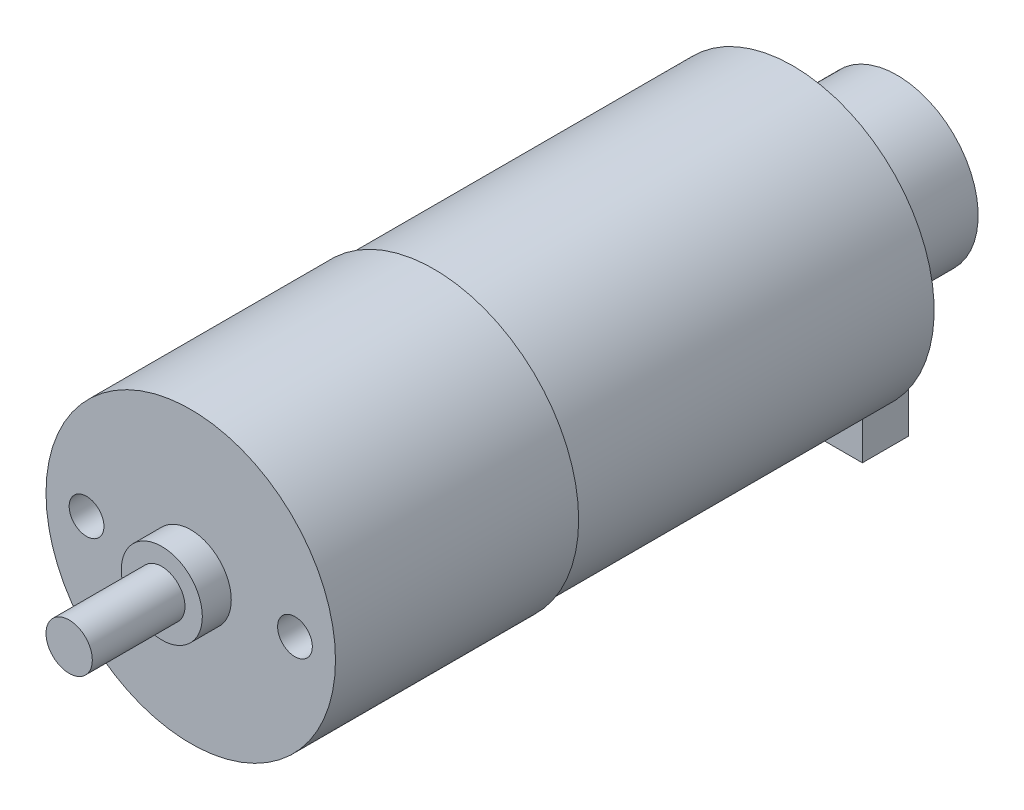
ISO-10303-21;
HEADER;
FILE_DESCRIPTION(('STEP AP214'),'2;1');
FILE_NAME('part.step','',(''),(''),'','','');
FILE_SCHEMA(('AUTOMOTIVE_DESIGN { 1 0 10303 214 1 1 1 1 }'));
ENDSEC;
DATA;
#1=APPLICATION_CONTEXT('core data for automotive mechanical design processes');
#2=APPLICATION_PROTOCOL_DEFINITION('international standard','automotive_design',2000,#1);
#3=PRODUCT_CONTEXT('',#1,'mechanical');
#4=PRODUCT('Part','Part','',(#3));
#5=PRODUCT_RELATED_PRODUCT_CATEGORY('part','',(#4));
#6=PRODUCT_DEFINITION_FORMATION('','',#4);
#7=PRODUCT_DEFINITION_CONTEXT('part definition',#1,'design');
#8=PRODUCT_DEFINITION('design','',#6,#7);
#9=PRODUCT_DEFINITION_SHAPE('','',#8);
#10=(LENGTH_UNIT() NAMED_UNIT(*) SI_UNIT(.MILLI.,.METRE.));
#11=(NAMED_UNIT(*) PLANE_ANGLE_UNIT() SI_UNIT($,.RADIAN.));
#12=(NAMED_UNIT(*) SI_UNIT($,.STERADIAN.) SOLID_ANGLE_UNIT());
#13=UNCERTAINTY_MEASURE_WITH_UNIT(LENGTH_MEASURE(1.E-05),#10,'distance_accuracy_value','');
#14=(GEOMETRIC_REPRESENTATION_CONTEXT(3) GLOBAL_UNCERTAINTY_ASSIGNED_CONTEXT((#13)) GLOBAL_UNIT_ASSIGNED_CONTEXT((#10,
#11,#12)) REPRESENTATION_CONTEXT('',''));
#15=CARTESIAN_POINT('',(0.,0.,0.));
#16=DIRECTION('',(0.,0.,1.));
#17=DIRECTION('',(1.,0.,0.));
#18=AXIS2_PLACEMENT_3D('',#15,#16,#17);
#19=CARTESIAN_POINT('',(0.,0.,0.));
#20=DIRECTION('',(0.,0.,1.));
#21=DIRECTION('',(1.,0.,0.));
#22=AXIS2_PLACEMENT_3D('',#19,#20,#21);
#23=PLANE('',#22);
#24=CARTESIAN_POINT('',(0.,0.,0.));
#25=DIRECTION('',(0.,0.,-1.));
#26=DIRECTION('',(-1.,0.,0.));
#27=AXIS2_PLACEMENT_3D('',#24,#25,#26);
#28=CIRCLE('',#27,7.);
#29=CARTESIAN_POINT('',(-7.,0.,0.));
#30=VERTEX_POINT('',#29);
#31=EDGE_CURVE('E51',#30,#30,#28,.T.);
#32=ORIENTED_EDGE('',*,*,#31,.F.);
#33=EDGE_LOOP('',(#32));
#34=FACE_BOUND('',#33,.T.);
#35=DIRECTION('',(0.,-1.,0.));
#36=VECTOR('',#35,1.);
#37=CARTESIAN_POINT('',(6.,-7.5,0.));
#38=LINE('',#37,#36);
#39=CARTESIAN_POINT('',(6.,-7.5,0.));
#40=VERTEX_POINT('',#39);
#41=CARTESIAN_POINT('',(6.,-10.6226173799116,0.));
#42=VERTEX_POINT('',#41);
#43=EDGE_CURVE('E176',#40,#42,#38,.T.);
#44=ORIENTED_EDGE('',*,*,#43,.F.);
#45=DIRECTION('',(1.,0.,0.));
#46=VECTOR('',#45,1.);
#47=CARTESIAN_POINT('',(6.,-7.5,0.));
#48=LINE('',#47,#46);
#49=CARTESIAN_POINT('',(-6.,-7.5,0.));
#50=VERTEX_POINT('',#49);
#51=EDGE_CURVE('E58',#50,#40,#48,.T.);
#52=ORIENTED_EDGE('',*,*,#51,.F.);
#53=DIRECTION('',(0.,1.,0.));
#54=VECTOR('',#53,1.);
#55=CARTESIAN_POINT('',(-6.,0.,0.));
#56=LINE('',#55,#54);
#57=CARTESIAN_POINT('',(-6.,-10.6226173799116,0.));
#58=VERTEX_POINT('',#57);
#59=EDGE_CURVE('E11',#58,#50,#56,.T.);
#60=ORIENTED_EDGE('',*,*,#59,.F.);
#61=CARTESIAN_POINT('',(0.,0.,0.));
#62=DIRECTION('',(0.,0.,1.));
#63=DIRECTION('',(1.,0.,0.));
#64=AXIS2_PLACEMENT_3D('',#61,#62,#63);
#65=CIRCLE('',#64,12.2);
#66=EDGE_CURVE('E62',#42,#58,#65,.T.);
#67=ORIENTED_EDGE('',*,*,#66,.F.);
#68=EDGE_LOOP('',(#44,#52,#60,#67));
#69=FACE_BOUND('',#68,.T.);
#70=ADVANCED_FACE('F42',(#34,#69),#23,.F.);
#71=CARTESIAN_POINT('',(0.,0.,31.));
#72=DIRECTION('',(0.,0.,-1.));
#73=DIRECTION('',(-1.,0.,0.));
#74=AXIS2_PLACEMENT_3D('',#71,#72,#73);
#75=CYLINDRICAL_SURFACE('',#74,12.2);
#76=CARTESIAN_POINT('',(0.,0.,31.));
#77=DIRECTION('',(0.,0.,1.));
#78=DIRECTION('',(1.,0.,0.));
#79=AXIS2_PLACEMENT_3D('',#76,#77,#78);
#80=CIRCLE('',#79,12.2);
#81=CARTESIAN_POINT('',(12.2,0.,31.));
#82=VERTEX_POINT('',#81);
#83=EDGE_CURVE('E146',#82,#82,#80,.T.);
#84=ORIENTED_EDGE('',*,*,#83,.F.);
#85=EDGE_LOOP('',(#84));
#86=FACE_BOUND('',#85,.T.);
#87=EDGE_CURVE('E156',#58,#42,#65,.T.);
#88=ORIENTED_EDGE('',*,*,#87,.T.);
#89=ORIENTED_EDGE('',*,*,#66,.T.);
#90=EDGE_LOOP('',(#88,#89));
#91=FACE_BOUND('',#90,.T.);
#92=ADVANCED_FACE('F44',(#86,#91),#75,.T.);
#93=CARTESIAN_POINT('',(0.,0.,52.));
#94=DIRECTION('',(0.,0.,-1.));
#95=DIRECTION('',(-1.,0.,0.));
#96=AXIS2_PLACEMENT_3D('',#93,#94,#95);
#97=CYLINDRICAL_SURFACE('',#96,12.5);
#98=CARTESIAN_POINT('',(0.,0.,52.));
#99=DIRECTION('',(0.,0.,1.));
#100=DIRECTION('',(1.,0.,0.));
#101=AXIS2_PLACEMENT_3D('',#98,#99,#100);
#102=CIRCLE('',#101,12.5);
#103=CARTESIAN_POINT('',(-12.5,0.,52.));
#104=VERTEX_POINT('',#103);
#105=EDGE_CURVE('E147',#104,#104,#102,.T.);
#106=CARTESIAN_POINT('',(0.,0.,31.));
#107=DIRECTION('',(0.,0.,1.));
#108=DIRECTION('',(1.,0.,0.));
#109=AXIS2_PLACEMENT_3D('',#106,#107,#108);
#110=CIRCLE('',#109,12.5);
#111=CARTESIAN_POINT('',(-12.5,0.,31.));
#112=VERTEX_POINT('',#111);
#113=EDGE_CURVE('E142',#112,#112,#110,.T.);
#114=CARTESIAN_POINT('',(-12.5,0.,52.));
#115=CARTESIAN_POINT('',(-12.5,0.,51.78125));
#116=CARTESIAN_POINT('',(-12.5,0.,51.5625));
#117=CARTESIAN_POINT('',(-12.5,0.,51.125));
#118=CARTESIAN_POINT('',(-12.5,0.,50.90625));
#119=CARTESIAN_POINT('',(-12.5,0.,50.46875));
#120=CARTESIAN_POINT('',(-12.5,0.,50.25));
#121=CARTESIAN_POINT('',(-12.5,0.,49.8125));
#122=CARTESIAN_POINT('',(-12.5,0.,49.59375));
#123=CARTESIAN_POINT('',(-12.5,0.,49.15625));
#124=CARTESIAN_POINT('',(-12.5,0.,48.9375));
#125=CARTESIAN_POINT('',(-12.5,0.,48.5));
#126=CARTESIAN_POINT('',(-12.5,0.,48.28125));
#127=CARTESIAN_POINT('',(-12.5,0.,47.84375));
#128=CARTESIAN_POINT('',(-12.5,0.,47.625));
#129=CARTESIAN_POINT('',(-12.5,0.,47.1875));
#130=CARTESIAN_POINT('',(-12.5,0.,46.96875));
#131=CARTESIAN_POINT('',(-12.5,0.,46.53125));
#132=CARTESIAN_POINT('',(-12.5,0.,46.3125));
#133=CARTESIAN_POINT('',(-12.5,0.,45.875));
#134=CARTESIAN_POINT('',(-12.5,0.,45.65625));
#135=CARTESIAN_POINT('',(-12.5,0.,45.21875));
#136=CARTESIAN_POINT('',(-12.5,0.,45.));
#137=CARTESIAN_POINT('',(-12.5,0.,44.5625));
#138=CARTESIAN_POINT('',(-12.5,0.,44.34375));
#139=CARTESIAN_POINT('',(-12.5,0.,43.90625));
#140=CARTESIAN_POINT('',(-12.5,0.,43.6875));
#141=CARTESIAN_POINT('',(-12.5,0.,43.25));
#142=CARTESIAN_POINT('',(-12.5,0.,43.03125));
#143=CARTESIAN_POINT('',(-12.5,0.,42.59375));
#144=CARTESIAN_POINT('',(-12.5,0.,42.375));
#145=CARTESIAN_POINT('',(-12.5,0.,41.9375));
#146=CARTESIAN_POINT('',(-12.5,0.,41.71875));
#147=CARTESIAN_POINT('',(-12.5,0.,41.28125));
#148=CARTESIAN_POINT('',(-12.5,0.,41.0625));
#149=CARTESIAN_POINT('',(-12.5,0.,40.625));
#150=CARTESIAN_POINT('',(-12.5,0.,40.40625));
#151=CARTESIAN_POINT('',(-12.5,0.,39.96875));
#152=CARTESIAN_POINT('',(-12.5,0.,39.75));
#153=CARTESIAN_POINT('',(-12.5,0.,39.3125));
#154=CARTESIAN_POINT('',(-12.5,0.,39.09375));
#155=CARTESIAN_POINT('',(-12.5,0.,38.65625));
#156=CARTESIAN_POINT('',(-12.5,0.,38.4375));
#157=CARTESIAN_POINT('',(-12.5,0.,38.));
#158=CARTESIAN_POINT('',(-12.5,0.,37.78125));
#159=CARTESIAN_POINT('',(-12.5,0.,37.34375));
#160=CARTESIAN_POINT('',(-12.5,0.,37.125));
#161=CARTESIAN_POINT('',(-12.5,0.,36.6875));
#162=CARTESIAN_POINT('',(-12.5,0.,36.46875));
#163=CARTESIAN_POINT('',(-12.5,0.,36.03125));
#164=CARTESIAN_POINT('',(-12.5,0.,35.8125));
#165=CARTESIAN_POINT('',(-12.5,0.,35.375));
#166=CARTESIAN_POINT('',(-12.5,0.,35.15625));
#167=CARTESIAN_POINT('',(-12.5,0.,34.71875));
#168=CARTESIAN_POINT('',(-12.5,0.,34.5));
#169=CARTESIAN_POINT('',(-12.5,0.,34.0625));
#170=CARTESIAN_POINT('',(-12.5,0.,33.84375));
#171=CARTESIAN_POINT('',(-12.5,0.,33.40625));
#172=CARTESIAN_POINT('',(-12.5,0.,33.1875));
#173=CARTESIAN_POINT('',(-12.5,0.,32.75));
#174=CARTESIAN_POINT('',(-12.5,0.,32.53125));
#175=CARTESIAN_POINT('',(-12.5,0.,32.09375));
#176=CARTESIAN_POINT('',(-12.5,0.,31.875));
#177=CARTESIAN_POINT('',(-12.5,0.,31.4375));
#178=CARTESIAN_POINT('',(-12.5,0.,31.21875));
#179=CARTESIAN_POINT('',(-12.5,0.,31.));
#180=B_SPLINE_CURVE_WITH_KNOTS('',3,(#114,#115,#116,#117,#118,#119,#120,#121,#122,#123,#124,
#125,#126,#127,#128,#129,#130,#131,#132,#133,#134,#135,#136,#137,#138,#139,#140,#141,#142,#143,
#144,#145,#146,#147,#148,#149,#150,#151,#152,#153,#154,#155,#156,#157,#158,#159,#160,#161,#162,
#163,#164,#165,#166,#167,#168,#169,#170,#171,#172,#173,#174,#175,#176,#177,#178,#179),
.UNSPECIFIED.,.F.,.F.,(4,2,2,2,2,2,2,2,2,2,2,2,2,2,2,2,2,2,2,2,2,2,2,2,2,2,2,2,2,2,2,2,4),(0.,
0.656250000000004,1.3125,1.96875000000001,2.625,3.28125000000001,3.9375,4.59375000000001,5.25,
5.90625,6.56250000000001,7.21875,7.87500000000001,8.53125,9.1875,9.84375000000001,10.5,11.15625,
11.8125,12.46875,13.125,13.78125,14.4375,15.09375,15.75,16.40625,17.0625,17.71875,18.375,
19.03125,19.6875,20.34375,21.),.UNSPECIFIED.);
#181=EDGE_CURVE('BSEAM223',#104,#112,#180,.T.);
#182=ORIENTED_EDGE('',*,*,#105,.F.);
#183=ORIENTED_EDGE('',*,*,#113,.T.);
#184=ORIENTED_EDGE('',*,*,#181,.T.);
#185=ORIENTED_EDGE('',*,*,#181,.F.);
#186=EDGE_LOOP('',(#182,#184,#183,#185));
#187=FACE_BOUND('',#186,.T.);
#188=ADVANCED_FACE('F223',(#187),#97,.T.);
#189=CARTESIAN_POINT('',(0.,0.,52.));
#190=DIRECTION('',(0.,0.,1.));
#191=DIRECTION('',(1.,0.,0.));
#192=AXIS2_PLACEMENT_3D('',#189,#190,#191);
#193=PLANE('',#192);
#194=CARTESIAN_POINT('',(-9.,0.,52.));
#195=DIRECTION('',(0.,0.,1.));
#196=DIRECTION('',(1.,0.,0.));
#197=AXIS2_PLACEMENT_3D('',#194,#195,#196);
#198=CIRCLE('',#197,1.5);
#199=CARTESIAN_POINT('',(-7.5,0.,52.));
#200=VERTEX_POINT('',#199);
#201=EDGE_CURVE('E194',#200,#200,#198,.T.);
#202=ORIENTED_EDGE('',*,*,#201,.F.);
#203=EDGE_LOOP('',(#202));
#204=FACE_BOUND('',#203,.T.);
#205=CARTESIAN_POINT('',(9.,0.,52.));
#206=DIRECTION('',(0.,0.,1.));
#207=DIRECTION('',(1.,0.,0.));
#208=AXIS2_PLACEMENT_3D('',#205,#206,#207);
#209=CIRCLE('',#208,1.5);
#210=CARTESIAN_POINT('',(10.5,0.,52.));
#211=VERTEX_POINT('',#210);
#212=EDGE_CURVE('E200',#211,#211,#209,.T.);
#213=ORIENTED_EDGE('',*,*,#212,.F.);
#214=EDGE_LOOP('',(#213));
#215=FACE_BOUND('',#214,.T.);
#216=CARTESIAN_POINT('',(0.,0.,52.));
#217=DIRECTION('',(0.,0.,1.));
#218=DIRECTION('',(1.,0.,0.));
#219=AXIS2_PLACEMENT_3D('',#216,#217,#218);
#220=CIRCLE('',#219,3.5);
#221=CARTESIAN_POINT('',(3.5,0.,52.));
#222=VERTEX_POINT('',#221);
#223=EDGE_CURVE('E138',#222,#222,#220,.T.);
#224=ORIENTED_EDGE('',*,*,#223,.F.);
#225=EDGE_LOOP('',(#224));
#226=FACE_BOUND('',#225,.T.);
#227=ORIENTED_EDGE('',*,*,#105,.T.);
#228=EDGE_LOOP('',(#227));
#229=FACE_BOUND('',#228,.T.);
#230=ADVANCED_FACE('F219',(#204,#215,#226,#229),#193,.T.);
#231=CARTESIAN_POINT('',(0.,0.,31.));
#232=DIRECTION('',(0.,0.,1.));
#233=DIRECTION('',(1.,0.,0.));
#234=AXIS2_PLACEMENT_3D('',#231,#232,#233);
#235=PLANE('',#234);
#236=ORIENTED_EDGE('',*,*,#83,.T.);
#237=EDGE_LOOP('',(#236));
#238=FACE_BOUND('',#237,.T.);
#239=ORIENTED_EDGE('',*,*,#113,.F.);
#240=EDGE_LOOP('',(#239));
#241=FACE_BOUND('',#240,.T.);
#242=ADVANCED_FACE('F222',(#238,#241),#235,.F.);
#243=CARTESIAN_POINT('',(0.,0.,54.5));
#244=DIRECTION('',(0.,0.,-1.));
#245=DIRECTION('',(-1.,0.,0.));
#246=AXIS2_PLACEMENT_3D('',#243,#244,#245);
#247=CYLINDRICAL_SURFACE('',#246,3.5);
#248=CARTESIAN_POINT('',(0.,0.,54.5));
#249=DIRECTION('',(0.,0.,1.));
#250=DIRECTION('',(1.,0.,0.));
#251=AXIS2_PLACEMENT_3D('',#248,#249,#250);
#252=CIRCLE('',#251,3.5);
#253=CARTESIAN_POINT('',(3.5,0.,54.5));
#254=VERTEX_POINT('',#253);
#255=EDGE_CURVE('E134',#254,#254,#252,.T.);
#256=ORIENTED_EDGE('',*,*,#255,.F.);
#257=EDGE_LOOP('',(#256));
#258=FACE_BOUND('',#257,.T.);
#259=ORIENTED_EDGE('',*,*,#223,.T.);
#260=EDGE_LOOP('',(#259));
#261=FACE_BOUND('',#260,.T.);
#262=ADVANCED_FACE('F236',(#258,#261),#247,.T.);
#263=CARTESIAN_POINT('',(0.,0.,54.5));
#264=DIRECTION('',(0.,0.,1.));
#265=DIRECTION('',(1.,0.,0.));
#266=AXIS2_PLACEMENT_3D('',#263,#264,#265);
#267=PLANE('',#266);
#268=CARTESIAN_POINT('',(0.,0.,54.5));
#269=DIRECTION('',(0.,0.,1.));
#270=DIRECTION('',(1.,0.,0.));
#271=AXIS2_PLACEMENT_3D('',#268,#269,#270);
#272=CIRCLE('',#271,2.);
#273=CARTESIAN_POINT('',(2.,0.,54.5));
#274=VERTEX_POINT('',#273);
#275=EDGE_CURVE('E130',#274,#274,#272,.T.);
#276=ORIENTED_EDGE('',*,*,#275,.F.);
#277=EDGE_LOOP('',(#276));
#278=FACE_BOUND('',#277,.T.);
#279=ORIENTED_EDGE('',*,*,#255,.T.);
#280=EDGE_LOOP('',(#279));
#281=FACE_BOUND('',#280,.T.);
#282=ADVANCED_FACE('F242',(#278,#281),#267,.T.);
#283=CARTESIAN_POINT('',(0.,0.,62.5));
#284=DIRECTION('',(0.,0.,-1.));
#285=DIRECTION('',(-1.,0.,0.));
#286=AXIS2_PLACEMENT_3D('',#283,#284,#285);
#287=CYLINDRICAL_SURFACE('',#286,2.);
#288=CARTESIAN_POINT('',(0.,0.,62.5));
#289=DIRECTION('',(0.,0.,1.));
#290=DIRECTION('',(1.,0.,0.));
#291=AXIS2_PLACEMENT_3D('',#288,#289,#290);
#292=CIRCLE('',#291,2.);
#293=CARTESIAN_POINT('',(2.,0.,62.5));
#294=VERTEX_POINT('',#293);
#295=EDGE_CURVE('E121',#294,#294,#292,.T.);
#296=ORIENTED_EDGE('',*,*,#295,.F.);
#297=EDGE_LOOP('',(#296));
#298=FACE_BOUND('',#297,.T.);
#299=ORIENTED_EDGE('',*,*,#275,.T.);
#300=EDGE_LOOP('',(#299));
#301=FACE_BOUND('',#300,.T.);
#302=ADVANCED_FACE('F265',(#298,#301),#287,.T.);
#303=CARTESIAN_POINT('',(0.,0.,62.5));
#304=DIRECTION('',(0.,0.,1.));
#305=DIRECTION('',(1.,0.,0.));
#306=AXIS2_PLACEMENT_3D('',#303,#304,#305);
#307=PLANE('',#306);
#308=ORIENTED_EDGE('',*,*,#295,.T.);
#309=EDGE_LOOP('',(#308));
#310=FACE_BOUND('',#309,.T.);
#311=ADVANCED_FACE('F256',(#310),#307,.T.);
#312=CARTESIAN_POINT('',(0.,0.,-9.));
#313=DIRECTION('',(0.,0.,1.));
#314=DIRECTION('',(1.,0.,0.));
#315=AXIS2_PLACEMENT_3D('',#312,#313,#314);
#316=CYLINDRICAL_SURFACE('',#315,7.);
#317=CARTESIAN_POINT('',(0.,0.,-9.));
#318=DIRECTION('',(0.,0.,-1.));
#319=DIRECTION('',(-1.,0.,0.));
#320=AXIS2_PLACEMENT_3D('',#317,#318,#319);
#321=CIRCLE('',#320,7.);
#322=CARTESIAN_POINT('',(-7.,0.,-9.));
#323=VERTEX_POINT('',#322);
#324=EDGE_CURVE('E116',#323,#323,#321,.T.);
#325=ORIENTED_EDGE('',*,*,#324,.F.);
#326=EDGE_LOOP('',(#325));
#327=FACE_BOUND('',#326,.T.);
#328=ORIENTED_EDGE('',*,*,#31,.T.);
#329=EDGE_LOOP('',(#328));
#330=FACE_BOUND('',#329,.T.);
#331=ADVANCED_FACE('F253',(#327,#330),#316,.T.);
#332=CARTESIAN_POINT('',(0.,0.,-9.));
#333=DIRECTION('',(0.,0.,-1.));
#334=DIRECTION('',(-1.,0.,0.));
#335=AXIS2_PLACEMENT_3D('',#332,#333,#334);
#336=PLANE('',#335);
#337=ORIENTED_EDGE('',*,*,#324,.T.);
#338=EDGE_LOOP('',(#337));
#339=FACE_BOUND('',#338,.T.);
#340=ADVANCED_FACE('F255',(#339),#336,.T.);
#341=CARTESIAN_POINT('',(6.,-7.5,-4.));
#342=DIRECTION('',(-1.,0.,0.));
#343=DIRECTION('',(0.,-1.,0.));
#344=AXIS2_PLACEMENT_3D('',#341,#342,#343);
#345=PLANE('',#344);
#346=ORIENTED_EDGE('',*,*,#43,.T.);
#347=CARTESIAN_POINT('',(6.,-14.5,0.));
#348=VERTEX_POINT('',#347);
#349=EDGE_CURVE('E113',#42,#348,#38,.T.);
#350=ORIENTED_EDGE('',*,*,#349,.T.);
#351=DIRECTION('',(0.,0.,1.));
#352=VECTOR('',#351,1.);
#353=CARTESIAN_POINT('',(6.,-14.5,-4.));
#354=LINE('',#353,#352);
#355=CARTESIAN_POINT('',(6.,-14.5,-4.));
#356=VERTEX_POINT('',#355);
#357=EDGE_CURVE('E92',#356,#348,#354,.T.);
#358=ORIENTED_EDGE('',*,*,#357,.F.);
#359=DIRECTION('',(0.,-1.,0.));
#360=VECTOR('',#359,1.);
#361=CARTESIAN_POINT('',(6.,-7.5,-4.));
#362=LINE('',#361,#360);
#363=CARTESIAN_POINT('',(6.,-7.5,-4.));
#364=VERTEX_POINT('',#363);
#365=EDGE_CURVE('E99',#364,#356,#362,.T.);
#366=ORIENTED_EDGE('',*,*,#365,.F.);
#367=DIRECTION('',(0.,0.,1.));
#368=VECTOR('',#367,1.);
#369=CARTESIAN_POINT('',(6.,-7.5,-4.));
#370=LINE('',#369,#368);
#371=EDGE_CURVE('E180',#364,#40,#370,.T.);
#372=ORIENTED_EDGE('',*,*,#371,.T.);
#373=EDGE_LOOP('',(#346,#350,#358,#366,#372));
#374=FACE_BOUND('',#373,.T.);
#375=ADVANCED_FACE('F111',(#374),#345,.F.);
#376=CARTESIAN_POINT('',(6.,-14.5,-4.));
#377=DIRECTION('',(0.,1.,0.));
#378=DIRECTION('',(-1.,0.,0.));
#379=AXIS2_PLACEMENT_3D('',#376,#377,#378);
#380=PLANE('',#379);
#381=DIRECTION('',(-1.,0.,0.));
#382=VECTOR('',#381,1.);
#383=CARTESIAN_POINT('',(6.,-14.5,0.));
#384=LINE('',#383,#382);
#385=CARTESIAN_POINT('',(-6.,-14.5,0.));
#386=VERTEX_POINT('',#385);
#387=EDGE_CURVE('E171',#348,#386,#384,.T.);
#388=ORIENTED_EDGE('',*,*,#387,.T.);
#389=DIRECTION('',(0.,0.,1.));
#390=VECTOR('',#389,1.);
#391=CARTESIAN_POINT('',(-6.,-14.5,-4.));
#392=LINE('',#391,#390);
#393=CARTESIAN_POINT('',(-6.,-14.5,-4.));
#394=VERTEX_POINT('',#393);
#395=EDGE_CURVE('E94',#394,#386,#392,.T.);
#396=ORIENTED_EDGE('',*,*,#395,.F.);
#397=DIRECTION('',(-1.,0.,0.));
#398=VECTOR('',#397,1.);
#399=CARTESIAN_POINT('',(6.,-14.5,-4.));
#400=LINE('',#399,#398);
#401=EDGE_CURVE('E88',#356,#394,#400,.T.);
#402=ORIENTED_EDGE('',*,*,#401,.F.);
#403=ORIENTED_EDGE('',*,*,#357,.T.);
#404=EDGE_LOOP('',(#388,#396,#402,#403));
#405=FACE_BOUND('',#404,.T.);
#406=ADVANCED_FACE('F90',(#405),#380,.F.);
#407=CARTESIAN_POINT('',(-6.,-7.5,-4.));
#408=DIRECTION('',(1.,0.,0.));
#409=DIRECTION('',(0.,1.,0.));
#410=AXIS2_PLACEMENT_3D('',#407,#408,#409);
#411=PLANE('',#410);
#412=DIRECTION('',(0.,1.,0.));
#413=VECTOR('',#412,1.);
#414=CARTESIAN_POINT('',(-6.,-7.5,0.));
#415=LINE('',#414,#413);
#416=EDGE_CURVE('E165',#386,#58,#415,.T.);
#417=ORIENTED_EDGE('',*,*,#416,.T.);
#418=ORIENTED_EDGE('',*,*,#59,.T.);
#419=DIRECTION('',(0.,0.,1.));
#420=VECTOR('',#419,1.);
#421=CARTESIAN_POINT('',(-6.,-7.5,-4.));
#422=LINE('',#421,#420);
#423=CARTESIAN_POINT('',(-6.,-7.5,-4.));
#424=VERTEX_POINT('',#423);
#425=EDGE_CURVE('E123',#424,#50,#422,.T.);
#426=ORIENTED_EDGE('',*,*,#425,.F.);
#427=DIRECTION('',(0.,1.,0.));
#428=VECTOR('',#427,1.);
#429=CARTESIAN_POINT('',(-6.,-7.5,-4.));
#430=LINE('',#429,#428);
#431=EDGE_CURVE('E98',#394,#424,#430,.T.);
#432=ORIENTED_EDGE('',*,*,#431,.F.);
#433=ORIENTED_EDGE('',*,*,#395,.T.);
#434=EDGE_LOOP('',(#417,#418,#426,#432,#433));
#435=FACE_BOUND('',#434,.T.);
#436=ADVANCED_FACE('F167',(#435),#411,.F.);
#437=CARTESIAN_POINT('',(6.,-7.5,-4.));
#438=DIRECTION('',(0.,-1.,0.));
#439=DIRECTION('',(1.,0.,0.));
#440=AXIS2_PLACEMENT_3D('',#437,#438,#439);
#441=PLANE('',#440);
#442=ORIENTED_EDGE('',*,*,#51,.T.);
#443=ORIENTED_EDGE('',*,*,#371,.F.);
#444=DIRECTION('',(1.,0.,0.));
#445=VECTOR('',#444,1.);
#446=CARTESIAN_POINT('',(6.,-7.5,-4.));
#447=LINE('',#446,#445);
#448=EDGE_CURVE('E104',#424,#364,#447,.T.);
#449=ORIENTED_EDGE('',*,*,#448,.F.);
#450=ORIENTED_EDGE('',*,*,#425,.T.);
#451=EDGE_LOOP('',(#442,#443,#449,#450));
#452=FACE_BOUND('',#451,.T.);
#453=ADVANCED_FACE('F184',(#452),#441,.F.);
#454=CARTESIAN_POINT('',(0.,0.,-4.));
#455=DIRECTION('',(0.,0.,-1.));
#456=DIRECTION('',(-1.,0.,0.));
#457=AXIS2_PLACEMENT_3D('',#454,#455,#456);
#458=PLANE('',#457);
#459=ORIENTED_EDGE('',*,*,#365,.T.);
#460=ORIENTED_EDGE('',*,*,#401,.T.);
#461=ORIENTED_EDGE('',*,*,#431,.T.);
#462=ORIENTED_EDGE('',*,*,#448,.T.);
#463=EDGE_LOOP('',(#459,#460,#461,#462));
#464=FACE_BOUND('',#463,.T.);
#465=ADVANCED_FACE('F102',(#464),#458,.T.);
#466=CARTESIAN_POINT('',(0.,0.,0.));
#467=DIRECTION('',(0.,0.,-1.));
#468=DIRECTION('',(-1.,0.,0.));
#469=AXIS2_PLACEMENT_3D('',#466,#467,#468);
#470=PLANE('',#469);
#471=ORIENTED_EDGE('',*,*,#349,.F.);
#472=ORIENTED_EDGE('',*,*,#87,.F.);
#473=ORIENTED_EDGE('',*,*,#416,.F.);
#474=ORIENTED_EDGE('',*,*,#387,.F.);
#475=EDGE_LOOP('',(#471,#472,#473,#474));
#476=FACE_BOUND('',#475,.T.);
#477=ADVANCED_FACE('F164',(#476),#470,.F.);
#478=CARTESIAN_POINT('',(9.,0.,45.));
#479=DIRECTION('',(0.,0.,1.));
#480=DIRECTION('',(1.,0.,0.));
#481=AXIS2_PLACEMENT_3D('',#478,#479,#480);
#482=CYLINDRICAL_SURFACE('',#481,1.5);
#483=CARTESIAN_POINT('',(9.,0.,45.));
#484=DIRECTION('',(0.,0.,1.));
#485=DIRECTION('',(1.,0.,0.));
#486=AXIS2_PLACEMENT_3D('',#483,#484,#485);
#487=CIRCLE('',#486,1.5);
#488=CARTESIAN_POINT('',(10.5,0.,45.));
#489=VERTEX_POINT('',#488);
#490=EDGE_CURVE('E206',#489,#489,#487,.T.);
#491=ORIENTED_EDGE('',*,*,#490,.F.);
#492=EDGE_LOOP('',(#491));
#493=FACE_BOUND('',#492,.T.);
#494=ORIENTED_EDGE('',*,*,#212,.T.);
#495=EDGE_LOOP('',(#494));
#496=FACE_BOUND('',#495,.T.);
#497=ADVANCED_FACE('F213',(#493,#496),#482,.F.);
#498=CARTESIAN_POINT('',(9.,0.,45.));
#499=DIRECTION('',(0.,0.,1.));
#500=DIRECTION('',(1.,0.,0.));
#501=AXIS2_PLACEMENT_3D('',#498,#499,#500);
#502=PLANE('',#501);
#503=ORIENTED_EDGE('',*,*,#490,.T.);
#504=EDGE_LOOP('',(#503));
#505=FACE_BOUND('',#504,.T.);
#506=ADVANCED_FACE('F211',(#505),#502,.T.);
#507=CARTESIAN_POINT('',(-9.,0.,45.));
#508=DIRECTION('',(0.,0.,1.));
#509=DIRECTION('',(1.,0.,0.));
#510=AXIS2_PLACEMENT_3D('',#507,#508,#509);
#511=CYLINDRICAL_SURFACE('',#510,1.5);
#512=CARTESIAN_POINT('',(-9.,0.,45.));
#513=DIRECTION('',(0.,0.,1.));
#514=DIRECTION('',(1.,0.,0.));
#515=AXIS2_PLACEMENT_3D('',#512,#513,#514);
#516=CIRCLE('',#515,1.5);
#517=CARTESIAN_POINT('',(-7.5,0.,45.));
#518=VERTEX_POINT('',#517);
#519=EDGE_CURVE('E191',#518,#518,#516,.T.);
#520=ORIENTED_EDGE('',*,*,#519,.F.);
#521=EDGE_LOOP('',(#520));
#522=FACE_BOUND('',#521,.T.);
#523=ORIENTED_EDGE('',*,*,#201,.T.);
#524=EDGE_LOOP('',(#523));
#525=FACE_BOUND('',#524,.T.);
#526=ADVANCED_FACE('F395',(#522,#525),#511,.F.);
#527=CARTESIAN_POINT('',(-9.,0.,45.));
#528=DIRECTION('',(0.,0.,1.));
#529=DIRECTION('',(1.,0.,0.));
#530=AXIS2_PLACEMENT_3D('',#527,#528,#529);
#531=PLANE('',#530);
#532=ORIENTED_EDGE('',*,*,#519,.T.);
#533=EDGE_LOOP('',(#532));
#534=FACE_BOUND('',#533,.T.);
#535=ADVANCED_FACE('F405',(#534),#531,.T.);
#536=CLOSED_SHELL('',(#70,#92,#188,#230,#242,#262,#282,#302,#311,#331,#340,#375,#406,#436,#453,
#465,#477,#497,#506,#526,#535));
#537=MANIFOLD_SOLID_BREP('B2',#536);
#538=ADVANCED_BREP_SHAPE_REPRESENTATION('',(#18,#537),#14);
#539=SHAPE_DEFINITION_REPRESENTATION(#9,#538);
ENDSEC;
END-ISO-10303-21;
